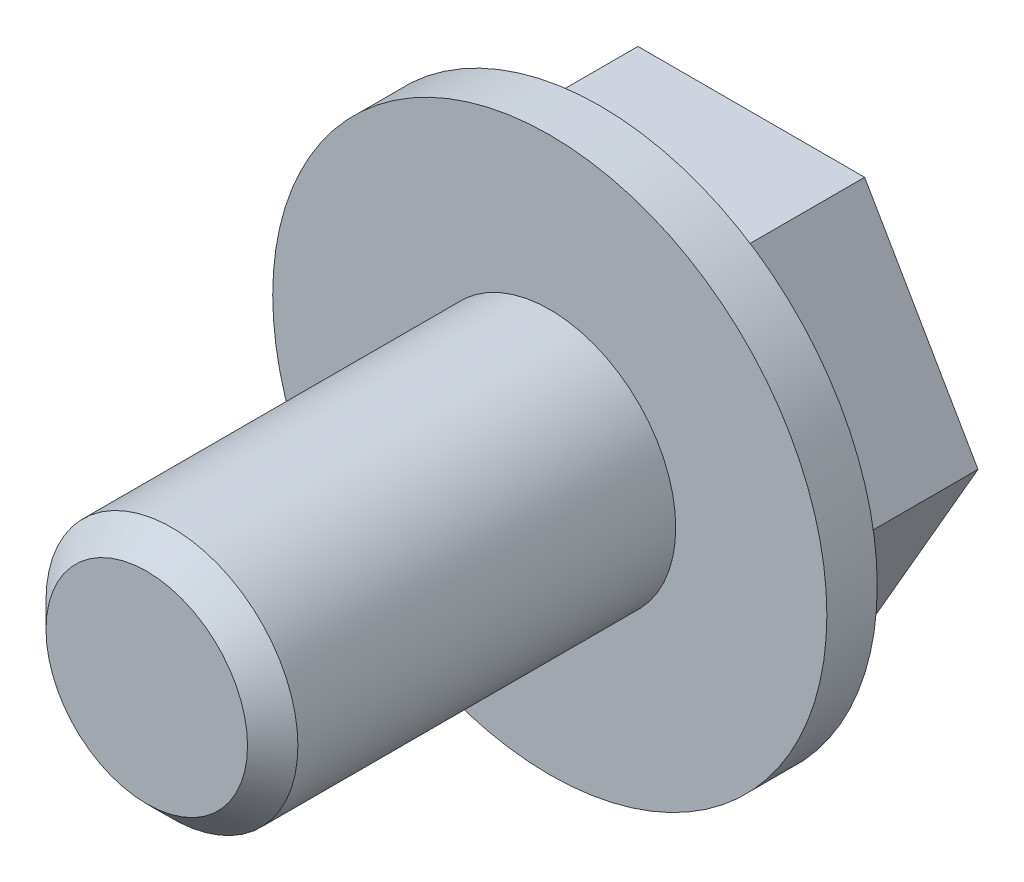
ISO-10303-21;
HEADER;
FILE_DESCRIPTION(('STEP AP214'),'2;1');
FILE_NAME('part.step','',(''),(''),'','','');
FILE_SCHEMA(('AUTOMOTIVE_DESIGN { 1 0 10303 214 1 1 1 1 }'));
ENDSEC;
DATA;
#1=APPLICATION_CONTEXT('core data for automotive mechanical design processes');
#2=APPLICATION_PROTOCOL_DEFINITION('international standard','automotive_design',2000,#1);
#3=PRODUCT_CONTEXT('',#1,'mechanical');
#4=PRODUCT('Part','Part','',(#3));
#5=PRODUCT_RELATED_PRODUCT_CATEGORY('part','',(#4));
#6=PRODUCT_DEFINITION_FORMATION('','',#4);
#7=PRODUCT_DEFINITION_CONTEXT('part definition',#1,'design');
#8=PRODUCT_DEFINITION('design','',#6,#7);
#9=PRODUCT_DEFINITION_SHAPE('','',#8);
#10=(LENGTH_UNIT() NAMED_UNIT(*) SI_UNIT(.MILLI.,.METRE.));
#11=(NAMED_UNIT(*) PLANE_ANGLE_UNIT() SI_UNIT($,.RADIAN.));
#12=(NAMED_UNIT(*) SI_UNIT($,.STERADIAN.) SOLID_ANGLE_UNIT());
#13=UNCERTAINTY_MEASURE_WITH_UNIT(LENGTH_MEASURE(1.E-05),#10,'distance_accuracy_value','');
#14=(GEOMETRIC_REPRESENTATION_CONTEXT(3) GLOBAL_UNCERTAINTY_ASSIGNED_CONTEXT((#13)) GLOBAL_UNIT_ASSIGNED_CONTEXT((#10,
#11,#12)) REPRESENTATION_CONTEXT('',''));
#15=CARTESIAN_POINT('',(0.,0.,0.));
#16=DIRECTION('',(0.,0.,1.));
#17=DIRECTION('',(1.,0.,0.));
#18=AXIS2_PLACEMENT_3D('',#15,#16,#17);
#19=CARTESIAN_POINT('',(-180.5318687822,2.831868782241,-65.20077123982));
#20=DIRECTION('',(0.,0.,-1.));
#21=DIRECTION('',(1.,0.,0.));
#22=AXIS2_PLACEMENT_3D('',#19,#20,#21);
#23=PLANE('',#22);
#24=DIRECTION('',(0.,-1.,0.));
#25=VECTOR('',#24,1.);
#26=CARTESIAN_POINT('',(-176.7923497493,-1.81530050143685,-65.20077123982));
#27=LINE('',#26,#25);
#28=CARTESIAN_POINT('',(-176.79234974929,-0.907650250718408,-65.20077123982));
#29=VERTEX_POINT('',#28);
#30=CARTESIAN_POINT('',(-176.792349749304,-2.722950752155,-65.20077123982));
#31=VERTEX_POINT('',#30);
#32=EDGE_CURVE('E167',#29,#31,#27,.T.);
#33=ORIENTED_EDGE('',*,*,#32,.T.);
#34=DIRECTION('',(-1.,0.,0.));
#35=VECTOR('',#34,1.);
#36=CARTESIAN_POINT('',(-177.7,-2.722950752155,-65.20077123982));
#37=LINE('',#36,#35);
#38=CARTESIAN_POINT('',(-178.607650250696,-2.72295075215507,-65.20077123982));
#39=VERTEX_POINT('',#38);
#40=EDGE_CURVE('E149',#31,#39,#37,.T.);
#41=ORIENTED_EDGE('',*,*,#40,.T.);
#42=DIRECTION('',(0.,1.,0.));
#43=VECTOR('',#42,1.);
#44=CARTESIAN_POINT('',(-178.6076502507,-1.81530050143685,-65.20077123982));
#45=LINE('',#44,#43);
#46=CARTESIAN_POINT('',(-178.607650250709,-0.907650250718546,-65.20077123982));
#47=VERTEX_POINT('',#46);
#48=EDGE_CURVE('E155',#39,#47,#45,.T.);
#49=ORIENTED_EDGE('',*,*,#48,.T.);
#50=DIRECTION('',(-1.,0.,0.));
#51=VECTOR('',#50,1.);
#52=CARTESIAN_POINT('',(-179.51530050145,-0.9076502507184,-65.20077123982));
#53=LINE('',#52,#51);
#54=CARTESIAN_POINT('',(-180.422950752151,-0.907650250718393,-65.20077123982));
#55=VERTEX_POINT('',#54);
#56=EDGE_CURVE('E272',#47,#55,#53,.T.);
#57=ORIENTED_EDGE('',*,*,#56,.T.);
#58=DIRECTION('',(0.,1.,0.));
#59=VECTOR('',#58,1.);
#60=CARTESIAN_POINT('',(-180.4229507522,0.,-65.20077123982));
#61=LINE('',#60,#59);
#62=CARTESIAN_POINT('',(-180.422950752151,0.907650250718328,-65.20077123982));
#63=VERTEX_POINT('',#62);
#64=EDGE_CURVE('E278',#55,#63,#61,.T.);
#65=ORIENTED_EDGE('',*,*,#64,.T.);
#66=DIRECTION('',(1.,0.,0.));
#67=VECTOR('',#66,1.);
#68=CARTESIAN_POINT('',(-179.51530050145,0.9076502507184,-65.20077123982));
#69=LINE('',#68,#67);
#70=CARTESIAN_POINT('',(-178.60765025071,0.907650250718408,-65.20077123982));
#71=VERTEX_POINT('',#70);
#72=EDGE_CURVE('E284',#63,#71,#69,.T.);
#73=ORIENTED_EDGE('',*,*,#72,.T.);
#74=DIRECTION('',(0.,1.,0.));
#75=VECTOR('',#74,1.);
#76=CARTESIAN_POINT('',(-178.6076502507,1.81530050143685,-65.20077123982));
#77=LINE('',#76,#75);
#78=CARTESIAN_POINT('',(-178.607650250696,2.722950752155,-65.20077123982));
#79=VERTEX_POINT('',#78);
#80=EDGE_CURVE('E290',#71,#79,#77,.T.);
#81=ORIENTED_EDGE('',*,*,#80,.T.);
#82=DIRECTION('',(1.,0.,0.));
#83=VECTOR('',#82,1.);
#84=CARTESIAN_POINT('',(-177.7,2.722950752155,-65.20077123982));
#85=LINE('',#84,#83);
#86=CARTESIAN_POINT('',(-176.792349749304,2.72295075215507,-65.20077123982));
#87=VERTEX_POINT('',#86);
#88=EDGE_CURVE('E296',#79,#87,#85,.T.);
#89=ORIENTED_EDGE('',*,*,#88,.T.);
#90=DIRECTION('',(0.,-1.,0.));
#91=VECTOR('',#90,1.);
#92=CARTESIAN_POINT('',(-176.7923497493,1.81530050143685,-65.20077123982));
#93=LINE('',#92,#91);
#94=CARTESIAN_POINT('',(-176.79234974929,0.907650250718473,-65.20077123982));
#95=VERTEX_POINT('',#94);
#96=EDGE_CURVE('E302',#87,#95,#93,.T.);
#97=ORIENTED_EDGE('',*,*,#96,.T.);
#98=DIRECTION('',(1.,0.,0.));
#99=VECTOR('',#98,1.);
#100=CARTESIAN_POINT('',(-175.88469949855,0.9076502507184,-65.20077123982));
#101=LINE('',#100,#99);
#102=CARTESIAN_POINT('',(-174.97704924785,0.907650250718393,-65.20077123982));
#103=VERTEX_POINT('',#102);
#104=EDGE_CURVE('E308',#95,#103,#101,.T.);
#105=ORIENTED_EDGE('',*,*,#104,.T.);
#106=DIRECTION('',(0.,-1.,0.));
#107=VECTOR('',#106,1.);
#108=CARTESIAN_POINT('',(-174.9770492478,0.,-65.20077123982));
#109=LINE('',#108,#107);
#110=CARTESIAN_POINT('',(-174.97704924785,-0.907650250718328,-65.20077123982));
#111=VERTEX_POINT('',#110);
#112=EDGE_CURVE('E314',#103,#111,#109,.T.);
#113=ORIENTED_EDGE('',*,*,#112,.T.);
#114=DIRECTION('',(-1.,0.,0.));
#115=VECTOR('',#114,1.);
#116=CARTESIAN_POINT('',(-175.88469949855,-0.9076502507184,-65.20077123982));
#117=LINE('',#116,#115);
#118=EDGE_CURVE('E320',#111,#29,#117,.T.);
#119=ORIENTED_EDGE('',*,*,#118,.T.);
#120=EDGE_LOOP('',(#33,#41,#49,#57,#65,#73,#81,#89,#97,#105,#113,#119));
#121=FACE_BOUND('',#120,.T.);
#122=ADVANCED_FACE('F17',(#121),#23,.T.);
#123=CARTESIAN_POINT('',(-178.6076502507,-2.759256762184,-65.16077123982));
#124=DIRECTION('',(-1.,0.,0.));
#125=DIRECTION('',(0.,1.,0.));
#126=AXIS2_PLACEMENT_3D('',#123,#124,#125);
#127=PLANE('',#126);
#128=ORIENTED_EDGE('',*,*,#48,.F.);
#129=DIRECTION('',(0.,0.,-1.));
#130=VECTOR('',#129,1.);
#131=CARTESIAN_POINT('',(-178.607650250673,-2.722950752155,-66.20077123982));
#132=LINE('',#131,#130);
#133=CARTESIAN_POINT('',(-178.607650250698,-2.72295075215514,-67.20077123982));
#134=VERTEX_POINT('',#133);
#135=EDGE_CURVE('E158',#39,#134,#132,.T.);
#136=ORIENTED_EDGE('',*,*,#135,.T.);
#137=DIRECTION('',(0.,-1.,0.));
#138=VECTOR('',#137,1.);
#139=CARTESIAN_POINT('',(-178.607650250719,0.,-67.20077123982));
#140=LINE('',#139,#138);
#141=CARTESIAN_POINT('',(-178.607650250712,-0.907650250718546,-67.20077123982));
#142=VERTEX_POINT('',#141);
#143=EDGE_CURVE('E267',#142,#134,#140,.T.);
#144=ORIENTED_EDGE('',*,*,#143,.F.);
#145=DIRECTION('',(0.,0.,1.));
#146=VECTOR('',#145,1.);
#147=CARTESIAN_POINT('',(-178.607650250729,-0.9076502507184,-66.20077123982));
#148=LINE('',#147,#146);
#149=EDGE_CURVE('E160',#142,#47,#148,.T.);
#150=ORIENTED_EDGE('',*,*,#149,.T.);
#151=EDGE_LOOP('',(#128,#136,#144,#150));
#152=FACE_BOUND('',#151,.T.);
#153=ADVANCED_FACE('F156',(#152),#127,.F.);
#154=CARTESIAN_POINT('',(-176.7560437393,-2.722950752155,-65.16077123982));
#155=DIRECTION('',(0.,-1.,0.));
#156=DIRECTION('',(-1.,0.,0.));
#157=AXIS2_PLACEMENT_3D('',#154,#155,#156);
#158=PLANE('',#157);
#159=ORIENTED_EDGE('',*,*,#40,.F.);
#160=DIRECTION('',(0.,0.,-1.));
#161=VECTOR('',#160,1.);
#162=CARTESIAN_POINT('',(-176.7923497493,-2.72295075215501,-66.20077123982));
#163=LINE('',#162,#161);
#164=CARTESIAN_POINT('',(-176.792349749309,-2.722950752155,-67.20077123982));
#165=VERTEX_POINT('',#164);
#166=EDGE_CURVE('E322',#31,#165,#163,.T.);
#167=ORIENTED_EDGE('',*,*,#166,.T.);
#168=DIRECTION('',(1.,0.,0.));
#169=VECTOR('',#168,1.);
#170=CARTESIAN_POINT('',(-177.7,-2.722950752155,-67.20077123982));
#171=LINE('',#170,#169);
#172=EDGE_CURVE('E166',#134,#165,#171,.T.);
#173=ORIENTED_EDGE('',*,*,#172,.F.);
#174=ORIENTED_EDGE('',*,*,#135,.F.);
#175=EDGE_LOOP('',(#159,#167,#173,#174));
#176=FACE_BOUND('',#175,.T.);
#177=ADVANCED_FACE('F165',(#176),#158,.F.);
#178=CARTESIAN_POINT('',(-176.7923497493,-0.8713442406897,-65.16077123982));
#179=DIRECTION('',(1.,0.,0.));
#180=DIRECTION('',(0.,-1.,0.));
#181=AXIS2_PLACEMENT_3D('',#178,#179,#180);
#182=PLANE('',#181);
#183=ORIENTED_EDGE('',*,*,#32,.F.);
#184=DIRECTION('',(0.,0.,-1.));
#185=VECTOR('',#184,1.);
#186=CARTESIAN_POINT('',(-176.792349749271,-0.9076502507184,-66.20077123982));
#187=LINE('',#186,#185);
#188=CARTESIAN_POINT('',(-176.792349749288,-0.907650250718416,-67.20077123982));
#189=VERTEX_POINT('',#188);
#190=EDGE_CURVE('E317',#29,#189,#187,.T.);
#191=ORIENTED_EDGE('',*,*,#190,.T.);
#192=DIRECTION('',(0.,1.,0.));
#193=VECTOR('',#192,1.);
#194=CARTESIAN_POINT('',(-176.792349749281,0.,-67.20077123982));
#195=LINE('',#194,#193);
#196=EDGE_CURVE('E264',#165,#189,#195,.T.);
#197=ORIENTED_EDGE('',*,*,#196,.F.);
#198=ORIENTED_EDGE('',*,*,#166,.F.);
#199=EDGE_LOOP('',(#183,#191,#197,#198));
#200=FACE_BOUND('',#199,.T.);
#201=ADVANCED_FACE('F325',(#200),#182,.F.);
#202=CARTESIAN_POINT('',(-174.9407432378,-0.9076502507184,-65.16077123982));
#203=DIRECTION('',(0.,-1.,0.));
#204=DIRECTION('',(-1.,0.,0.));
#205=AXIS2_PLACEMENT_3D('',#202,#203,#204);
#206=PLANE('',#205);
#207=ORIENTED_EDGE('',*,*,#118,.F.);
#208=DIRECTION('',(0.,0.,-1.));
#209=VECTOR('',#208,1.);
#210=CARTESIAN_POINT('',(-174.9770492478,-0.90765025071811,-66.20077123982));
#211=LINE('',#210,#209);
#212=CARTESIAN_POINT('',(-174.977049247826,-0.907650250718328,-67.20077123982));
#213=VERTEX_POINT('',#212);
#214=EDGE_CURVE('E311',#111,#213,#211,.T.);
#215=ORIENTED_EDGE('',*,*,#214,.T.);
#216=DIRECTION('',(1.,0.,0.));
#217=VECTOR('',#216,1.);
#218=CARTESIAN_POINT('',(-177.7,-0.9076502507184,-67.20077123982));
#219=LINE('',#218,#217);
#220=EDGE_CURVE('E262',#189,#213,#219,.T.);
#221=ORIENTED_EDGE('',*,*,#220,.F.);
#222=ORIENTED_EDGE('',*,*,#190,.F.);
#223=EDGE_LOOP('',(#207,#215,#221,#222));
#224=FACE_BOUND('',#223,.T.);
#225=ADVANCED_FACE('F362',(#224),#206,.F.);
#226=CARTESIAN_POINT('',(-174.9770492478,0.9439562607471,-65.16077123982));
#227=DIRECTION('',(1.,0.,0.));
#228=DIRECTION('',(0.,-1.,0.));
#229=AXIS2_PLACEMENT_3D('',#226,#227,#228);
#230=PLANE('',#229);
#231=ORIENTED_EDGE('',*,*,#112,.F.);
#232=DIRECTION('',(0.,0.,-1.));
#233=VECTOR('',#232,1.);
#234=CARTESIAN_POINT('',(-174.977049247829,0.9076502507184,-66.20077123982));
#235=LINE('',#234,#233);
#236=CARTESIAN_POINT('',(-174.977049247819,0.907650250718385,-67.20077123982));
#237=VERTEX_POINT('',#236);
#238=EDGE_CURVE('E305',#103,#237,#235,.T.);
#239=ORIENTED_EDGE('',*,*,#238,.T.);
#240=DIRECTION('',(0.,1.,0.));
#241=VECTOR('',#240,1.);
#242=CARTESIAN_POINT('',(-174.977049247845,0.,-67.20077123982));
#243=LINE('',#242,#241);
#244=EDGE_CURVE('E260',#213,#237,#243,.T.);
#245=ORIENTED_EDGE('',*,*,#244,.F.);
#246=ORIENTED_EDGE('',*,*,#214,.F.);
#247=EDGE_LOOP('',(#231,#239,#245,#246));
#248=FACE_BOUND('',#247,.T.);
#249=ADVANCED_FACE('F359',(#248),#230,.F.);
#250=CARTESIAN_POINT('',(-176.8286557593,0.9076502507184,-65.16077123982));
#251=DIRECTION('',(0.,1.,0.));
#252=DIRECTION('',(1.,0.,0.));
#253=AXIS2_PLACEMENT_3D('',#250,#251,#252);
#254=PLANE('',#253);
#255=ORIENTED_EDGE('',*,*,#104,.F.);
#256=DIRECTION('',(0.,0.,-1.));
#257=VECTOR('',#256,1.);
#258=CARTESIAN_POINT('',(-176.7923497493,0.907650250718692,-66.20077123982));
#259=LINE('',#258,#257);
#260=CARTESIAN_POINT('',(-176.792349749281,0.907650250718473,-67.20077123982));
#261=VERTEX_POINT('',#260);
#262=EDGE_CURVE('E299',#95,#261,#259,.T.);
#263=ORIENTED_EDGE('',*,*,#262,.T.);
#264=DIRECTION('',(-1.,0.,0.));
#265=VECTOR('',#264,1.);
#266=CARTESIAN_POINT('',(-177.7,0.9076502507184,-67.20077123982));
#267=LINE('',#266,#265);
#268=EDGE_CURVE('E258',#237,#261,#267,.T.);
#269=ORIENTED_EDGE('',*,*,#268,.F.);
#270=ORIENTED_EDGE('',*,*,#238,.F.);
#271=EDGE_LOOP('',(#255,#263,#269,#270));
#272=FACE_BOUND('',#271,.T.);
#273=ADVANCED_FACE('F355',(#272),#254,.F.);
#274=CARTESIAN_POINT('',(-176.7923497493,2.759256762184,-65.16077123982));
#275=DIRECTION('',(1.,0.,0.));
#276=DIRECTION('',(0.,-1.,0.));
#277=AXIS2_PLACEMENT_3D('',#274,#275,#276);
#278=PLANE('',#277);
#279=ORIENTED_EDGE('',*,*,#96,.F.);
#280=DIRECTION('',(0.,0.,-1.));
#281=VECTOR('',#280,1.);
#282=CARTESIAN_POINT('',(-176.792349749327,2.722950752155,-66.20077123982));
#283=LINE('',#282,#281);
#284=CARTESIAN_POINT('',(-176.792349749302,2.72295075215514,-67.20077123982));
#285=VERTEX_POINT('',#284);
#286=EDGE_CURVE('E293',#87,#285,#283,.T.);
#287=ORIENTED_EDGE('',*,*,#286,.T.);
#288=DIRECTION('',(0.,1.,0.));
#289=VECTOR('',#288,1.);
#290=CARTESIAN_POINT('',(-176.792349749281,0.,-67.20077123982));
#291=LINE('',#290,#289);
#292=EDGE_CURVE('E256',#261,#285,#291,.T.);
#293=ORIENTED_EDGE('',*,*,#292,.F.);
#294=ORIENTED_EDGE('',*,*,#262,.F.);
#295=EDGE_LOOP('',(#279,#287,#293,#294));
#296=FACE_BOUND('',#295,.T.);
#297=ADVANCED_FACE('F351',(#296),#278,.F.);
#298=CARTESIAN_POINT('',(-178.6439562607,2.722950752155,-65.16077123982));
#299=DIRECTION('',(0.,1.,0.));
#300=DIRECTION('',(1.,0.,0.));
#301=AXIS2_PLACEMENT_3D('',#298,#299,#300);
#302=PLANE('',#301);
#303=ORIENTED_EDGE('',*,*,#88,.F.);
#304=DIRECTION('',(0.,0.,-1.));
#305=VECTOR('',#304,1.);
#306=CARTESIAN_POINT('',(-178.6076502507,2.72295075215501,-66.20077123982));
#307=LINE('',#306,#305);
#308=CARTESIAN_POINT('',(-178.607650250691,2.722950752155,-67.20077123982));
#309=VERTEX_POINT('',#308);
#310=EDGE_CURVE('E287',#79,#309,#307,.T.);
#311=ORIENTED_EDGE('',*,*,#310,.T.);
#312=DIRECTION('',(-1.,0.,0.));
#313=VECTOR('',#312,1.);
#314=CARTESIAN_POINT('',(-177.7,2.722950752155,-67.20077123982));
#315=LINE('',#314,#313);
#316=EDGE_CURVE('E254',#285,#309,#315,.T.);
#317=ORIENTED_EDGE('',*,*,#316,.F.);
#318=ORIENTED_EDGE('',*,*,#286,.F.);
#319=EDGE_LOOP('',(#303,#311,#317,#318));
#320=FACE_BOUND('',#319,.T.);
#321=ADVANCED_FACE('F347',(#320),#302,.F.);
#322=CARTESIAN_POINT('',(-178.6076502507,0.8713442406897,-65.16077123982));
#323=DIRECTION('',(-1.,0.,0.));
#324=DIRECTION('',(0.,1.,0.));
#325=AXIS2_PLACEMENT_3D('',#322,#323,#324);
#326=PLANE('',#325);
#327=ORIENTED_EDGE('',*,*,#80,.F.);
#328=DIRECTION('',(0.,0.,-1.));
#329=VECTOR('',#328,1.);
#330=CARTESIAN_POINT('',(-178.607650250729,0.9076502507184,-66.20077123982));
#331=LINE('',#330,#329);
#332=CARTESIAN_POINT('',(-178.607650250712,0.907650250718416,-67.20077123982));
#333=VERTEX_POINT('',#332);
#334=EDGE_CURVE('E281',#71,#333,#331,.T.);
#335=ORIENTED_EDGE('',*,*,#334,.T.);
#336=DIRECTION('',(0.,-1.,0.));
#337=VECTOR('',#336,1.);
#338=CARTESIAN_POINT('',(-178.607650250719,0.,-67.20077123982));
#339=LINE('',#338,#337);
#340=EDGE_CURVE('E252',#309,#333,#339,.T.);
#341=ORIENTED_EDGE('',*,*,#340,.F.);
#342=ORIENTED_EDGE('',*,*,#310,.F.);
#343=EDGE_LOOP('',(#327,#335,#341,#342));
#344=FACE_BOUND('',#343,.T.);
#345=ADVANCED_FACE('F343',(#344),#326,.F.);
#346=CARTESIAN_POINT('',(-180.4592567622,0.9076502507184,-65.16077123982));
#347=DIRECTION('',(0.,1.,0.));
#348=DIRECTION('',(1.,0.,0.));
#349=AXIS2_PLACEMENT_3D('',#346,#347,#348);
#350=PLANE('',#349);
#351=ORIENTED_EDGE('',*,*,#72,.F.);
#352=DIRECTION('',(0.,0.,-1.));
#353=VECTOR('',#352,1.);
#354=CARTESIAN_POINT('',(-180.4229507522,0.90765025071811,-66.20077123982));
#355=LINE('',#354,#353);
#356=CARTESIAN_POINT('',(-180.422950752175,0.907650250718328,-67.20077123982));
#357=VERTEX_POINT('',#356);
#358=EDGE_CURVE('E275',#63,#357,#355,.T.);
#359=ORIENTED_EDGE('',*,*,#358,.T.);
#360=DIRECTION('',(-1.,0.,0.));
#361=VECTOR('',#360,1.);
#362=CARTESIAN_POINT('',(-177.7,0.9076502507184,-67.20077123982));
#363=LINE('',#362,#361);
#364=EDGE_CURVE('E250',#333,#357,#363,.T.);
#365=ORIENTED_EDGE('',*,*,#364,.F.);
#366=ORIENTED_EDGE('',*,*,#334,.F.);
#367=EDGE_LOOP('',(#351,#359,#365,#366));
#368=FACE_BOUND('',#367,.T.);
#369=ADVANCED_FACE('F339',(#368),#350,.F.);
#370=CARTESIAN_POINT('',(-180.4229507522,-0.9439562607471,-65.16077123982));
#371=DIRECTION('',(-1.,0.,0.));
#372=DIRECTION('',(0.,1.,0.));
#373=AXIS2_PLACEMENT_3D('',#370,#371,#372);
#374=PLANE('',#373);
#375=ORIENTED_EDGE('',*,*,#64,.F.);
#376=DIRECTION('',(0.,0.,-1.));
#377=VECTOR('',#376,1.);
#378=CARTESIAN_POINT('',(-180.422950752171,-0.9076502507184,-66.20077123982));
#379=LINE('',#378,#377);
#380=CARTESIAN_POINT('',(-180.422950752182,-0.907650250718385,-67.20077123982));
#381=VERTEX_POINT('',#380);
#382=EDGE_CURVE('E269',#55,#381,#379,.T.);
#383=ORIENTED_EDGE('',*,*,#382,.T.);
#384=DIRECTION('',(0.,-1.,0.));
#385=VECTOR('',#384,1.);
#386=CARTESIAN_POINT('',(-180.422950752155,0.,-67.20077123982));
#387=LINE('',#386,#385);
#388=EDGE_CURVE('E248',#357,#381,#387,.T.);
#389=ORIENTED_EDGE('',*,*,#388,.F.);
#390=ORIENTED_EDGE('',*,*,#358,.F.);
#391=EDGE_LOOP('',(#375,#383,#389,#390));
#392=FACE_BOUND('',#391,.T.);
#393=ADVANCED_FACE('F336',(#392),#374,.F.);
#394=CARTESIAN_POINT('',(-178.5713442407,-0.9076502507184,-65.16077123982));
#395=DIRECTION('',(0.,-1.,0.));
#396=DIRECTION('',(-1.,0.,0.));
#397=AXIS2_PLACEMENT_3D('',#394,#395,#396);
#398=PLANE('',#397);
#399=ORIENTED_EDGE('',*,*,#56,.F.);
#400=ORIENTED_EDGE('',*,*,#149,.F.);
#401=DIRECTION('',(1.,0.,0.));
#402=VECTOR('',#401,1.);
#403=CARTESIAN_POINT('',(-177.7,-0.9076502507184,-67.20077123982));
#404=LINE('',#403,#402);
#405=EDGE_CURVE('E245',#381,#142,#404,.T.);
#406=ORIENTED_EDGE('',*,*,#405,.F.);
#407=ORIENTED_EDGE('',*,*,#382,.F.);
#408=EDGE_LOOP('',(#399,#400,#406,#407));
#409=FACE_BOUND('',#408,.T.);
#410=ADVANCED_FACE('F333',(#409),#398,.F.);
#411=CARTESIAN_POINT('',(-182.38,4.052998889711,-67.20077123982));
#412=DIRECTION('',(0.,0.,-1.));
#413=DIRECTION('',(1.,0.,0.));
#414=AXIS2_PLACEMENT_3D('',#411,#412,#413);
#415=PLANE('',#414);
#416=ORIENTED_EDGE('',*,*,#388,.T.);
#417=ORIENTED_EDGE('',*,*,#405,.T.);
#418=ORIENTED_EDGE('',*,*,#143,.T.);
#419=ORIENTED_EDGE('',*,*,#172,.T.);
#420=ORIENTED_EDGE('',*,*,#196,.T.);
#421=ORIENTED_EDGE('',*,*,#220,.T.);
#422=ORIENTED_EDGE('',*,*,#244,.T.);
#423=ORIENTED_EDGE('',*,*,#268,.T.);
#424=ORIENTED_EDGE('',*,*,#292,.T.);
#425=ORIENTED_EDGE('',*,*,#316,.T.);
#426=ORIENTED_EDGE('',*,*,#340,.T.);
#427=ORIENTED_EDGE('',*,*,#364,.T.);
#428=EDGE_LOOP('',(#416,#417,#418,#419,#420,#421,#422,#423,#424,#425,#426,#427));
#429=FACE_BOUND('',#428,.T.);
#430=DIRECTION('',(0.499999999999966,0.866025403784458,0.));
#431=VECTOR('',#430,1.);
#432=CARTESIAN_POINT('',(-174.325,-1.9485571585152,-67.20077123982));
#433=LINE('',#432,#431);
#434=CARTESIAN_POINT('',(-175.45,-3.8971143170301,-67.20077123982));
#435=VERTEX_POINT('',#434);
#436=CARTESIAN_POINT('',(-173.200000000072,1.24997920881672E-10,-67.20077123982));
#437=VERTEX_POINT('',#436);
#438=EDGE_CURVE('E192',#435,#437,#433,.T.);
#439=ORIENTED_EDGE('',*,*,#438,.F.);
#440=DIRECTION('',(1.,0.,0.));
#441=VECTOR('',#440,1.);
#442=CARTESIAN_POINT('',(-177.7,-3.89711431703,-67.20077123982));
#443=LINE('',#442,#441);
#444=CARTESIAN_POINT('',(-179.95,-3.8971143170302,-67.20077123982));
#445=VERTEX_POINT('',#444);
#446=EDGE_CURVE('E184',#445,#435,#443,.T.);
#447=ORIENTED_EDGE('',*,*,#446,.F.);
#448=DIRECTION('',(0.499999999999957,-0.866025403784463,0.));
#449=VECTOR('',#448,1.);
#450=CARTESIAN_POINT('',(-181.075,-1.9485571585152,-67.20077123982));
#451=LINE('',#450,#449);
#452=CARTESIAN_POINT('',(-182.199999999855,-2.4999860817295E-10,-67.20077123982));
#453=VERTEX_POINT('',#452);
#454=EDGE_CURVE('E185',#453,#445,#451,.T.);
#455=ORIENTED_EDGE('',*,*,#454,.F.);
#456=DIRECTION('',(-0.499999999999957,-0.866025403784463,0.));
#457=VECTOR('',#456,1.);
#458=CARTESIAN_POINT('',(-181.075,1.9485571585152,-67.20077123982));
#459=LINE('',#458,#457);
#460=CARTESIAN_POINT('',(-179.95,3.8971143170301,-67.20077123982));
#461=VERTEX_POINT('',#460);
#462=EDGE_CURVE('E61',#461,#453,#459,.T.);
#463=ORIENTED_EDGE('',*,*,#462,.F.);
#464=DIRECTION('',(-1.,0.,0.));
#465=VECTOR('',#464,1.);
#466=CARTESIAN_POINT('',(-177.7,3.89711431703,-67.20077123982));
#467=LINE('',#466,#465);
#468=CARTESIAN_POINT('',(-175.45,3.8971143170302,-67.20077123982));
#469=VERTEX_POINT('',#468);
#470=EDGE_CURVE('E179',#469,#461,#467,.T.);
#471=ORIENTED_EDGE('',*,*,#470,.F.);
#472=DIRECTION('',(-0.499999999999966,0.866025403784458,0.));
#473=VECTOR('',#472,1.);
#474=CARTESIAN_POINT('',(-174.325,1.9485571585152,-67.20077123982));
#475=LINE('',#474,#473);
#476=EDGE_CURVE('E196',#437,#469,#475,.T.);
#477=ORIENTED_EDGE('',*,*,#476,.F.);
#478=EDGE_LOOP('',(#439,#447,#455,#463,#471,#477));
#479=FACE_BOUND('',#478,.T.);
#480=ADVANCED_FACE('F238',(#429,#479),#415,.T.);
#481=CARTESIAN_POINT('',(-179.905,-3.975056603371,-64.14077123982));
#482=DIRECTION('',(-0.866025403784463,-0.499999999999958,0.));
#483=DIRECTION('',(-0.499999999999958,0.866025403784463,0.));
#484=AXIS2_PLACEMENT_3D('',#481,#482,#483);
#485=PLANE('',#484);
#486=ORIENTED_EDGE('',*,*,#454,.T.);
#487=DIRECTION('',(0.,0.,-1.));
#488=VECTOR('',#487,1.);
#489=CARTESIAN_POINT('',(-179.95,-3.89711431703,-65.70077123982));
#490=LINE('',#489,#488);
#491=CARTESIAN_POINT('',(-179.95,-3.89711431703001,-64.20077123982));
#492=VERTEX_POINT('',#491);
#493=EDGE_CURVE('E181',#492,#445,#490,.T.);
#494=ORIENTED_EDGE('',*,*,#493,.F.);
#495=DIRECTION('',(0.5,-0.86602540378444,0.));
#496=VECTOR('',#495,1.);
#497=CARTESIAN_POINT('',(-182.2,0.,-64.20077123982));
#498=LINE('',#497,#496);
#499=CARTESIAN_POINT('',(-182.2,0.,-64.20077123982));
#500=VERTEX_POINT('',#499);
#501=EDGE_CURVE('E21',#500,#492,#498,.T.);
#502=ORIENTED_EDGE('',*,*,#501,.F.);
#503=DIRECTION('',(0.,0.,1.));
#504=VECTOR('',#503,1.);
#505=CARTESIAN_POINT('',(-182.2,0.,-65.70077123982));
#506=LINE('',#505,#504);
#507=EDGE_CURVE('E55',#453,#500,#506,.T.);
#508=ORIENTED_EDGE('',*,*,#507,.F.);
#509=EDGE_LOOP('',(#486,#494,#502,#508));
#510=FACE_BOUND('',#509,.T.);
#511=ADVANCED_FACE('F233',(#510),#485,.T.);
#512=CARTESIAN_POINT('',(-175.36,-3.89711431703,-64.14077123982));
#513=DIRECTION('',(0.,-1.,0.));
#514=DIRECTION('',(-1.,0.,0.));
#515=AXIS2_PLACEMENT_3D('',#512,#513,#514);
#516=PLANE('',#515);
#517=ORIENTED_EDGE('',*,*,#446,.T.);
#518=DIRECTION('',(0.,0.,-1.));
#519=VECTOR('',#518,1.);
#520=CARTESIAN_POINT('',(-175.45,-3.89711431703039,-65.70077123982));
#521=LINE('',#520,#519);
#522=CARTESIAN_POINT('',(-175.45,-3.89711431703018,-64.20077123982));
#523=VERTEX_POINT('',#522);
#524=EDGE_CURVE('E189',#523,#435,#521,.T.);
#525=ORIENTED_EDGE('',*,*,#524,.F.);
#526=DIRECTION('',(1.,0.,0.));
#527=VECTOR('',#526,1.);
#528=CARTESIAN_POINT('',(-177.7,-3.89711431703,-64.20077123982));
#529=LINE('',#528,#527);
#530=EDGE_CURVE('E186',#492,#523,#529,.T.);
#531=ORIENTED_EDGE('',*,*,#530,.F.);
#532=ORIENTED_EDGE('',*,*,#493,.T.);
#533=EDGE_LOOP('',(#517,#525,#531,#532));
#534=FACE_BOUND('',#533,.T.);
#535=ADVANCED_FACE('F236',(#534),#516,.T.);
#536=CARTESIAN_POINT('',(-173.155,0.0779422863406,-64.14077123982));
#537=DIRECTION('',(0.866025403784458,-0.499999999999967,0.));
#538=DIRECTION('',(-0.499999999999967,-0.866025403784458,0.));
#539=AXIS2_PLACEMENT_3D('',#536,#537,#538);
#540=PLANE('',#539);
#541=ORIENTED_EDGE('',*,*,#438,.T.);
#542=DIRECTION('',(0.,0.,-1.));
#543=VECTOR('',#542,1.);
#544=CARTESIAN_POINT('',(-173.2,0.,-65.70077123982));
#545=LINE('',#544,#543);
#546=CARTESIAN_POINT('',(-173.2,0.,-64.20077123982));
#547=VERTEX_POINT('',#546);
#548=EDGE_CURVE('E193',#547,#437,#545,.T.);
#549=ORIENTED_EDGE('',*,*,#548,.F.);
#550=DIRECTION('',(0.5,0.86602540378444,0.));
#551=VECTOR('',#550,1.);
#552=CARTESIAN_POINT('',(-175.45,-3.89711431703,-64.20077123982));
#553=LINE('',#552,#551);
#554=EDGE_CURVE('E188',#523,#547,#553,.T.);
#555=ORIENTED_EDGE('',*,*,#554,.F.);
#556=ORIENTED_EDGE('',*,*,#524,.T.);
#557=EDGE_LOOP('',(#541,#549,#555,#556));
#558=FACE_BOUND('',#557,.T.);
#559=ADVANCED_FACE('F221',(#558),#540,.T.);
#560=CARTESIAN_POINT('',(-175.495,3.975056603371,-64.14077123982));
#561=DIRECTION('',(0.866025403784458,0.499999999999967,0.));
#562=DIRECTION('',(0.499999999999967,-0.866025403784458,0.));
#563=AXIS2_PLACEMENT_3D('',#560,#561,#562);
#564=PLANE('',#563);
#565=ORIENTED_EDGE('',*,*,#476,.T.);
#566=DIRECTION('',(0.,0.,-1.));
#567=VECTOR('',#566,1.);
#568=CARTESIAN_POINT('',(-175.45,3.89711431703,-65.70077123982));
#569=LINE('',#568,#567);
#570=CARTESIAN_POINT('',(-175.45,3.89711431703001,-64.20077123982));
#571=VERTEX_POINT('',#570);
#572=EDGE_CURVE('E197',#571,#469,#569,.T.);
#573=ORIENTED_EDGE('',*,*,#572,.F.);
#574=DIRECTION('',(-0.5,0.86602540378444,0.));
#575=VECTOR('',#574,1.);
#576=CARTESIAN_POINT('',(-173.2,0.,-64.20077123982));
#577=LINE('',#576,#575);
#578=EDGE_CURVE('E176',#547,#571,#577,.T.);
#579=ORIENTED_EDGE('',*,*,#578,.F.);
#580=ORIENTED_EDGE('',*,*,#548,.T.);
#581=EDGE_LOOP('',(#565,#573,#579,#580));
#582=FACE_BOUND('',#581,.T.);
#583=ADVANCED_FACE('F225',(#582),#564,.T.);
#584=CARTESIAN_POINT('',(-180.04,3.89711431703,-64.14077123982));
#585=DIRECTION('',(0.,1.,0.));
#586=DIRECTION('',(1.,0.,0.));
#587=AXIS2_PLACEMENT_3D('',#584,#585,#586);
#588=PLANE('',#587);
#589=ORIENTED_EDGE('',*,*,#470,.T.);
#590=DIRECTION('',(0.,0.,-1.));
#591=VECTOR('',#590,1.);
#592=CARTESIAN_POINT('',(-179.95,3.89711431703039,-65.70077123982));
#593=LINE('',#592,#591);
#594=CARTESIAN_POINT('',(-179.95,3.89711431703017,-64.20077123982));
#595=VERTEX_POINT('',#594);
#596=EDGE_CURVE('E177',#595,#461,#593,.T.);
#597=ORIENTED_EDGE('',*,*,#596,.F.);
#598=DIRECTION('',(-1.,0.,0.));
#599=VECTOR('',#598,1.);
#600=CARTESIAN_POINT('',(-177.7,3.89711431703,-64.20077123982));
#601=LINE('',#600,#599);
#602=EDGE_CURVE('E36',#571,#595,#601,.T.);
#603=ORIENTED_EDGE('',*,*,#602,.F.);
#604=ORIENTED_EDGE('',*,*,#572,.T.);
#605=EDGE_LOOP('',(#589,#597,#603,#604));
#606=FACE_BOUND('',#605,.T.);
#607=ADVANCED_FACE('F228',(#606),#588,.T.);
#608=CARTESIAN_POINT('',(-182.245,-0.0779422863406,-64.14077123982));
#609=DIRECTION('',(-0.866025403784463,0.499999999999958,0.));
#610=DIRECTION('',(0.499999999999958,0.866025403784463,0.));
#611=AXIS2_PLACEMENT_3D('',#608,#609,#610);
#612=PLANE('',#611);
#613=ORIENTED_EDGE('',*,*,#462,.T.);
#614=ORIENTED_EDGE('',*,*,#507,.T.);
#615=DIRECTION('',(-0.5,-0.86602540378444,0.));
#616=VECTOR('',#615,1.);
#617=CARTESIAN_POINT('',(-179.95,3.89711431703,-64.20077123982));
#618=LINE('',#617,#616);
#619=EDGE_CURVE('E175',#595,#500,#618,.T.);
#620=ORIENTED_EDGE('',*,*,#619,.F.);
#621=ORIENTED_EDGE('',*,*,#596,.T.);
#622=EDGE_LOOP('',(#613,#614,#620,#621));
#623=FACE_BOUND('',#622,.T.);
#624=ADVANCED_FACE('F229',(#623),#612,.T.);
#625=CARTESIAN_POINT('',(-179.7799999831,2.08,-55.20077123982));
#626=DIRECTION('',(0.,0.,1.));
#627=DIRECTION('',(0.,-1.,0.));
#628=AXIS2_PLACEMENT_3D('',#625,#626,#627);
#629=PLANE('',#628);
#630=CARTESIAN_POINT('',(-177.7,0.,-55.20077123982));
#631=DIRECTION('',(0.,0.,1.));
#632=DIRECTION('',(1.,0.,0.));
#633=AXIS2_PLACEMENT_3D('',#630,#631,#632);
#634=CIRCLE('',#633,1.99999598821819);
#635=CARTESIAN_POINT('',(-175.700004011782,0.,-55.20077123982));
#636=VERTEX_POINT('',#635);
#637=EDGE_CURVE('E208',#636,#636,#634,.T.);
#638=ORIENTED_EDGE('',*,*,#637,.T.);
#639=EDGE_LOOP('',(#638));
#640=FACE_BOUND('',#639,.T.);
#641=ADVANCED_FACE('F522',(#640),#629,.T.);
#642=CARTESIAN_POINT('',(-183.42,5.72,-64.20077123982));
#643=DIRECTION('',(0.,0.,-1.));
#644=DIRECTION('',(1.,0.,0.));
#645=AXIS2_PLACEMENT_3D('',#642,#643,#644);
#646=PLANE('',#645);
#647=ORIENTED_EDGE('',*,*,#602,.T.);
#648=ORIENTED_EDGE('',*,*,#619,.T.);
#649=ORIENTED_EDGE('',*,*,#501,.T.);
#650=ORIENTED_EDGE('',*,*,#530,.T.);
#651=ORIENTED_EDGE('',*,*,#554,.T.);
#652=ORIENTED_EDGE('',*,*,#578,.T.);
#653=EDGE_LOOP('',(#647,#648,#649,#650,#651,#652));
#654=FACE_BOUND('',#653,.T.);
#655=CARTESIAN_POINT('',(-177.7,0.,-64.2007712398264));
#656=DIRECTION('',(0.,0.,-1.));
#657=DIRECTION('',(-1.,0.,0.));
#658=AXIS2_PLACEMENT_3D('',#655,#656,#657);
#659=CIRCLE('',#658,5.5);
#660=CARTESIAN_POINT('',(-183.2,0.,-64.2007712398264));
#661=VERTEX_POINT('',#660);
#662=EDGE_CURVE('E205',#661,#661,#659,.T.);
#663=ORIENTED_EDGE('',*,*,#662,.T.);
#664=EDGE_LOOP('',(#663));
#665=FACE_BOUND('',#664,.T.);
#666=ADVANCED_FACE('F214',(#654,#665),#646,.T.);
#667=CARTESIAN_POINT('',(-177.7,0.,-55.2007732456595));
#668=DIRECTION('',(0.,0.,-1.));
#669=DIRECTION('',(-1.,0.,0.));
#670=AXIS2_PLACEMENT_3D('',#667,#668,#669);
#671=CONICAL_SURFACE('',#670,1.99999799405363,0.785397160453828);
#672=CARTESIAN_POINT('',(-177.7,0.,-55.7007762545545));
#673=DIRECTION('',(0.,0.,-1.));
#674=DIRECTION('',(-1.,0.,0.));
#675=AXIS2_PLACEMENT_3D('',#672,#673,#674);
#676=CIRCLE('',#675,2.5);
#677=CARTESIAN_POINT('',(-180.2,0.,-55.7007762545545));
#678=VERTEX_POINT('',#677);
#679=EDGE_CURVE('E202',#678,#678,#676,.F.);
#680=ORIENTED_EDGE('',*,*,#679,.T.);
#681=EDGE_LOOP('',(#680));
#682=FACE_BOUND('',#681,.T.);
#683=ORIENTED_EDGE('',*,*,#637,.F.);
#684=EDGE_LOOP('',(#683));
#685=FACE_BOUND('',#684,.T.);
#686=ADVANCED_FACE('F388',(#682,#685),#671,.T.);
#687=CARTESIAN_POINT('',(-177.7,0.,-63.2007712398237));
#688=DIRECTION('',(0.,0.,-1.));
#689=DIRECTION('',(-1.,0.,0.));
#690=AXIS2_PLACEMENT_3D('',#687,#688,#689);
#691=CYLINDRICAL_SURFACE('',#690,5.5);
#692=ORIENTED_EDGE('',*,*,#662,.F.);
#693=EDGE_LOOP('',(#692));
#694=FACE_BOUND('',#693,.T.);
#695=CARTESIAN_POINT('',(-177.7,0.,-63.2007712398237));
#696=DIRECTION('',(0.,0.,-1.));
#697=DIRECTION('',(-1.,0.,0.));
#698=AXIS2_PLACEMENT_3D('',#695,#696,#697);
#699=CIRCLE('',#698,5.5);
#700=CARTESIAN_POINT('',(-183.2,0.,-63.2007712398237));
#701=VERTEX_POINT('',#700);
#702=EDGE_CURVE('E27',#701,#701,#699,.T.);
#703=ORIENTED_EDGE('',*,*,#702,.T.);
#704=EDGE_LOOP('',(#703));
#705=FACE_BOUND('',#704,.T.);
#706=ADVANCED_FACE('F380',(#694,#705),#691,.T.);
#707=CARTESIAN_POINT('',(-177.7,0.,-63.2007712398261));
#708=DIRECTION('',(0.,0.,1.));
#709=DIRECTION('',(1.,0.,0.));
#710=AXIS2_PLACEMENT_3D('',#707,#708,#709);
#711=CYLINDRICAL_SURFACE('',#710,2.5);
#712=CARTESIAN_POINT('',(-177.7,0.,-63.2007712398261));
#713=DIRECTION('',(0.,0.,1.));
#714=DIRECTION('',(1.,0.,0.));
#715=AXIS2_PLACEMENT_3D('',#712,#713,#714);
#716=CIRCLE('',#715,2.5);
#717=CARTESIAN_POINT('',(-175.2,0.,-63.2007712398261));
#718=VERTEX_POINT('',#717);
#719=EDGE_CURVE('E11',#718,#718,#716,.T.);
#720=ORIENTED_EDGE('',*,*,#719,.T.);
#721=EDGE_LOOP('',(#720));
#722=FACE_BOUND('',#721,.T.);
#723=ORIENTED_EDGE('',*,*,#679,.F.);
#724=EDGE_LOOP('',(#723));
#725=FACE_BOUND('',#724,.T.);
#726=ADVANCED_FACE('F374',(#722,#725),#711,.T.);
#727=CARTESIAN_POINT('',(-183.42,5.72,-63.20077123982));
#728=DIRECTION('',(0.,0.,-1.));
#729=DIRECTION('',(1.,0.,0.));
#730=AXIS2_PLACEMENT_3D('',#727,#728,#729);
#731=PLANE('',#730);
#732=ORIENTED_EDGE('',*,*,#719,.F.);
#733=EDGE_LOOP('',(#732));
#734=FACE_BOUND('',#733,.T.);
#735=ORIENTED_EDGE('',*,*,#702,.F.);
#736=EDGE_LOOP('',(#735));
#737=FACE_BOUND('',#736,.T.);
#738=ADVANCED_FACE('F19',(#734,#737),#731,.F.);
#739=CLOSED_SHELL('',(#122,#153,#177,#201,#225,#249,#273,#297,#321,#345,#369,#393,#410,#480,
#511,#535,#559,#583,#607,#624,#641,#666,#686,#706,#726,#738));
#740=MANIFOLD_SOLID_BREP('B1',#739);
#741=ADVANCED_BREP_SHAPE_REPRESENTATION('',(#18,#740),#14);
#742=SHAPE_DEFINITION_REPRESENTATION(#9,#741);
ENDSEC;
END-ISO-10303-21;
